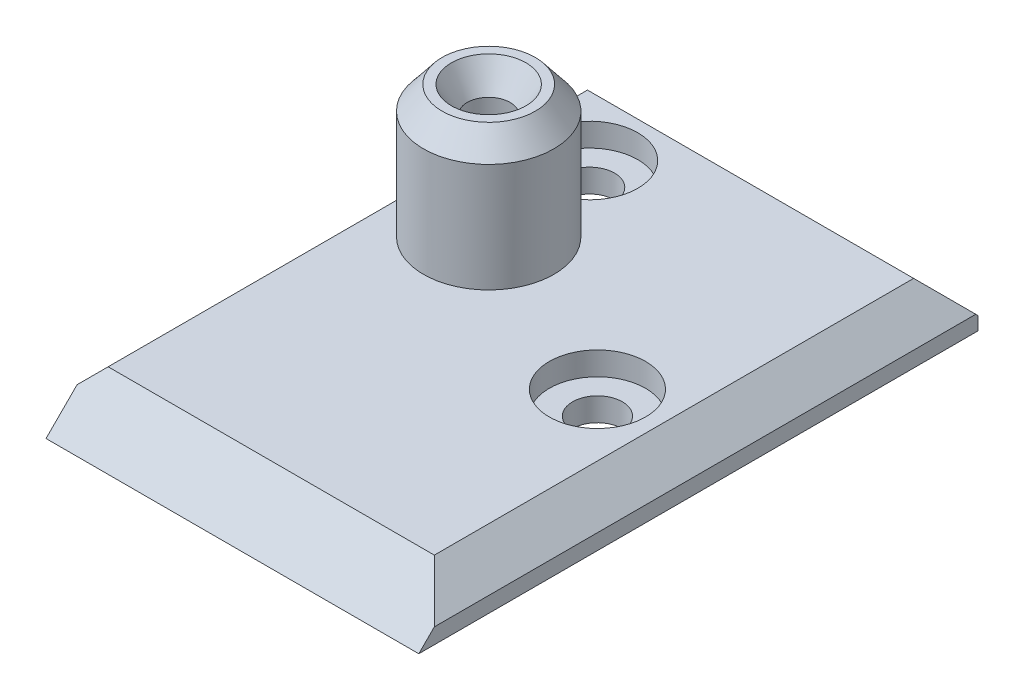
ISO-10303-21;
HEADER;
FILE_DESCRIPTION(('STEP AP214'),'2;1');
FILE_NAME('part.step','',(''),(''),'','','');
FILE_SCHEMA(('AUTOMOTIVE_DESIGN { 1 0 10303 214 1 1 1 1 }'));
ENDSEC;
DATA;
#1=APPLICATION_CONTEXT('core data for automotive mechanical design processes');
#2=APPLICATION_PROTOCOL_DEFINITION('international standard','automotive_design',2000,#1);
#3=PRODUCT_CONTEXT('',#1,'mechanical');
#4=PRODUCT('Part','Part','',(#3));
#5=PRODUCT_RELATED_PRODUCT_CATEGORY('part','',(#4));
#6=PRODUCT_DEFINITION_FORMATION('','',#4);
#7=PRODUCT_DEFINITION_CONTEXT('part definition',#1,'design');
#8=PRODUCT_DEFINITION('design','',#6,#7);
#9=PRODUCT_DEFINITION_SHAPE('','',#8);
#10=(LENGTH_UNIT() NAMED_UNIT(*) SI_UNIT(.MILLI.,.METRE.));
#11=(NAMED_UNIT(*) PLANE_ANGLE_UNIT() SI_UNIT($,.RADIAN.));
#12=(NAMED_UNIT(*) SI_UNIT($,.STERADIAN.) SOLID_ANGLE_UNIT());
#13=UNCERTAINTY_MEASURE_WITH_UNIT(LENGTH_MEASURE(1.E-05),#10,'distance_accuracy_value','');
#14=(GEOMETRIC_REPRESENTATION_CONTEXT(3) GLOBAL_UNCERTAINTY_ASSIGNED_CONTEXT((#13)) GLOBAL_UNIT_ASSIGNED_CONTEXT((#10,
#11,#12)) REPRESENTATION_CONTEXT('',''));
#15=CARTESIAN_POINT('',(0.,0.,0.));
#16=DIRECTION('',(0.,0.,1.));
#17=DIRECTION('',(1.,0.,0.));
#18=AXIS2_PLACEMENT_3D('',#15,#16,#17);
#19=CARTESIAN_POINT('',(0.,61.5,-17.));
#20=DIRECTION('',(0.,-1.,0.));
#21=DIRECTION('',(0.,0.,-1.));
#22=AXIS2_PLACEMENT_3D('',#19,#20,#21);
#23=PLANE('',#22);
#24=CARTESIAN_POINT('',(0.,61.5000000000237,-17.));
#25=DIRECTION('',(0.,1.,0.));
#26=DIRECTION('',(-1.,0.,0.));
#27=AXIS2_PLACEMENT_3D('',#24,#25,#26);
#28=CIRCLE('',#27,2.40000000004557);
#29=CARTESIAN_POINT('',(-2.40000000004557,61.5000000000237,-17.));
#30=VERTEX_POINT('',#29);
#31=EDGE_CURVE('E18',#30,#30,#28,.F.);
#32=ORIENTED_EDGE('',*,*,#31,.T.);
#33=EDGE_LOOP('',(#32));
#34=FACE_BOUND('',#33,.T.);
#35=CARTESIAN_POINT('',(0.,61.4999999999668,-17.));
#36=DIRECTION('',(0.,-1.,0.));
#37=DIRECTION('',(1.,0.,0.));
#38=AXIS2_PLACEMENT_3D('',#35,#36,#37);
#39=CIRCLE('',#38,3.00000000007685);
#40=CARTESIAN_POINT('',(3.00000000007685,61.4999999999668,-17.));
#41=VERTEX_POINT('',#40);
#42=EDGE_CURVE('E145',#41,#41,#39,.T.);
#43=ORIENTED_EDGE('',*,*,#42,.F.);
#44=EDGE_LOOP('',(#43));
#45=FACE_BOUND('',#44,.T.);
#46=ADVANCED_FACE('F15',(#34,#45),#23,.F.);
#47=CARTESIAN_POINT('',(0.,61.4999999997963,-17.));
#48=DIRECTION('',(0.,1.,0.));
#49=DIRECTION('',(-1.,0.,0.));
#50=AXIS2_PLACEMENT_3D('',#47,#48,#49);
#51=CONICAL_SURFACE('',#50,2.39999999990914,0.540419500280418);
#52=CARTESIAN_POINT('',(0.,59.7999999999956,-17.));
#53=DIRECTION('',(0.,1.,0.));
#54=DIRECTION('',(-1.,0.,0.));
#55=AXIS2_PLACEMENT_3D('',#52,#53,#54);
#56=CIRCLE('',#55,1.38000000000602);
#57=CARTESIAN_POINT('',(-1.38000000000603,59.7999999999956,-17.));
#58=VERTEX_POINT('',#57);
#59=EDGE_CURVE('E115',#58,#58,#56,.T.);
#60=ORIENTED_EDGE('',*,*,#59,.F.);
#61=EDGE_LOOP('',(#60));
#62=FACE_BOUND('',#61,.T.);
#63=ORIENTED_EDGE('',*,*,#31,.F.);
#64=EDGE_LOOP('',(#63));
#65=FACE_BOUND('',#64,.T.);
#66=ADVANCED_FACE('F154',(#62,#65),#51,.F.);
#67=CARTESIAN_POINT('',(0.,60.0000000001728,-17.));
#68=DIRECTION('',(0.,-1.,0.));
#69=DIRECTION('',(1.,0.,0.));
#70=AXIS2_PLACEMENT_3D('',#67,#68,#69);
#71=CONICAL_SURFACE('',#70,4.19999999991205,0.674740942223552);
#72=CARTESIAN_POINT('',(0.,60.,-17.));
#73=DIRECTION('',(0.,-1.,0.));
#74=DIRECTION('',(0.,0.,-1.));
#75=AXIS2_PLACEMENT_3D('',#72,#73,#74);
#76=CIRCLE('',#75,4.2);
#77=CARTESIAN_POINT('',(0.,60.,-21.2));
#78=VERTEX_POINT('',#77);
#79=EDGE_CURVE('E113',#78,#78,#76,.T.);
#80=ORIENTED_EDGE('',*,*,#79,.F.);
#81=EDGE_LOOP('',(#80));
#82=FACE_BOUND('',#81,.T.);
#83=ORIENTED_EDGE('',*,*,#42,.T.);
#84=EDGE_LOOP('',(#83));
#85=FACE_BOUND('',#84,.T.);
#86=ADVANCED_FACE('F156',(#82,#85),#71,.T.);
#87=CARTESIAN_POINT('',(0.,59.8,-17.));
#88=DIRECTION('',(0.,-1.,0.));
#89=DIRECTION('',(0.,0.,-1.));
#90=AXIS2_PLACEMENT_3D('',#87,#88,#89);
#91=PLANE('',#90);
#92=ORIENTED_EDGE('',*,*,#59,.T.);
#93=EDGE_LOOP('',(#92));
#94=FACE_BOUND('',#93,.T.);
#95=CARTESIAN_POINT('',(0.,59.8,-17.));
#96=DIRECTION('',(0.,-1.,0.));
#97=DIRECTION('',(0.,0.,-1.));
#98=AXIS2_PLACEMENT_3D('',#95,#96,#97);
#99=CIRCLE('',#98,2.2);
#100=CARTESIAN_POINT('',(0.,59.8,-19.2));
#101=VERTEX_POINT('',#100);
#102=EDGE_CURVE('E107',#101,#101,#99,.T.);
#103=ORIENTED_EDGE('',*,*,#102,.T.);
#104=EDGE_LOOP('',(#103));
#105=FACE_BOUND('',#104,.T.);
#106=ADVANCED_FACE('F163',(#94,#105),#91,.T.);
#107=CARTESIAN_POINT('',(0.,60.,-17.));
#108=DIRECTION('',(0.,-1.,0.));
#109=DIRECTION('',(0.,0.,-1.));
#110=AXIS2_PLACEMENT_3D('',#107,#108,#109);
#111=CYLINDRICAL_SURFACE('',#110,4.2);
#112=CARTESIAN_POINT('',(0.,53.,-17.));
#113=DIRECTION('',(0.,-1.,0.));
#114=DIRECTION('',(0.,0.,-1.));
#115=AXIS2_PLACEMENT_3D('',#112,#113,#114);
#116=CIRCLE('',#115,4.2);
#117=CARTESIAN_POINT('',(0.,53.,-21.2));
#118=VERTEX_POINT('',#117);
#119=EDGE_CURVE('E99',#118,#118,#116,.T.);
#120=ORIENTED_EDGE('',*,*,#119,.F.);
#121=EDGE_LOOP('',(#120));
#122=FACE_BOUND('',#121,.T.);
#123=ORIENTED_EDGE('',*,*,#79,.T.);
#124=EDGE_LOOP('',(#123));
#125=FACE_BOUND('',#124,.T.);
#126=ADVANCED_FACE('F233',(#122,#125),#111,.T.);
#127=CARTESIAN_POINT('',(-1.,54.5,-24.5));
#128=DIRECTION('',(0.,-1.,0.));
#129=DIRECTION('',(0.,0.,-1.));
#130=AXIS2_PLACEMENT_3D('',#127,#128,#129);
#131=CYLINDRICAL_SURFACE('',#130,3.1);
#132=CARTESIAN_POINT('',(-1.,51.5,-24.5));
#133=DIRECTION('',(0.,-1.,0.));
#134=DIRECTION('',(0.,0.,-1.));
#135=AXIS2_PLACEMENT_3D('',#132,#133,#134);
#136=CIRCLE('',#135,3.1);
#137=CARTESIAN_POINT('',(-1.,51.5,-27.6));
#138=VERTEX_POINT('',#137);
#139=EDGE_CURVE('E112',#138,#138,#136,.T.);
#140=ORIENTED_EDGE('',*,*,#139,.T.);
#141=EDGE_LOOP('',(#140));
#142=FACE_BOUND('',#141,.T.);
#143=CARTESIAN_POINT('',(-1.,53.,-24.5));
#144=DIRECTION('',(0.,-1.,0.));
#145=DIRECTION('',(0.,0.,-1.));
#146=AXIS2_PLACEMENT_3D('',#143,#144,#145);
#147=CIRCLE('',#146,3.1);
#148=CARTESIAN_POINT('',(-1.,53.,-27.6));
#149=VERTEX_POINT('',#148);
#150=EDGE_CURVE('E96',#149,#149,#147,.T.);
#151=ORIENTED_EDGE('',*,*,#150,.F.);
#152=EDGE_LOOP('',(#151));
#153=FACE_BOUND('',#152,.T.);
#154=ADVANCED_FACE('F229',(#142,#153),#131,.F.);
#155=CARTESIAN_POINT('',(0.,59.8,-17.));
#156=DIRECTION('',(0.,-1.,0.));
#157=DIRECTION('',(0.,0.,-1.));
#158=AXIS2_PLACEMENT_3D('',#155,#156,#157);
#159=CYLINDRICAL_SURFACE('',#158,2.2);
#160=CARTESIAN_POINT('',(0.,53.8999999999987,-17.));
#161=DIRECTION('',(0.,-1.,0.));
#162=DIRECTION('',(1.,0.,0.));
#163=AXIS2_PLACEMENT_3D('',#160,#161,#162);
#164=CIRCLE('',#163,2.20000000000198);
#165=CARTESIAN_POINT('',(2.20000000000198,53.8999999999987,-17.));
#166=VERTEX_POINT('',#165);
#167=EDGE_CURVE('E108',#166,#166,#164,.T.);
#168=ORIENTED_EDGE('',*,*,#167,.T.);
#169=EDGE_LOOP('',(#168));
#170=FACE_BOUND('',#169,.T.);
#171=ORIENTED_EDGE('',*,*,#102,.F.);
#172=EDGE_LOOP('',(#171));
#173=FACE_BOUND('',#172,.T.);
#174=ADVANCED_FACE('F225',(#170,#173),#159,.F.);
#175=CARTESIAN_POINT('',(12.,54.5,-12.));
#176=DIRECTION('',(0.,-1.,0.));
#177=DIRECTION('',(0.,0.,-1.));
#178=AXIS2_PLACEMENT_3D('',#175,#176,#177);
#179=CYLINDRICAL_SURFACE('',#178,3.1);
#180=CARTESIAN_POINT('',(12.,51.5,-12.));
#181=DIRECTION('',(0.,-1.,0.));
#182=DIRECTION('',(0.,0.,-1.));
#183=AXIS2_PLACEMENT_3D('',#180,#181,#182);
#184=CIRCLE('',#183,3.1);
#185=CARTESIAN_POINT('',(12.,51.5,-15.1));
#186=VERTEX_POINT('',#185);
#187=EDGE_CURVE('E111',#186,#186,#184,.T.);
#188=ORIENTED_EDGE('',*,*,#187,.T.);
#189=EDGE_LOOP('',(#188));
#190=FACE_BOUND('',#189,.T.);
#191=CARTESIAN_POINT('',(12.,53.,-12.));
#192=DIRECTION('',(0.,-1.,0.));
#193=DIRECTION('',(0.,0.,-1.));
#194=AXIS2_PLACEMENT_3D('',#191,#192,#193);
#195=CIRCLE('',#194,3.1);
#196=CARTESIAN_POINT('',(12.,53.,-15.1));
#197=VERTEX_POINT('',#196);
#198=EDGE_CURVE('E137',#197,#197,#195,.T.);
#199=ORIENTED_EDGE('',*,*,#198,.F.);
#200=EDGE_LOOP('',(#199));
#201=FACE_BOUND('',#200,.T.);
#202=ADVANCED_FACE('F222',(#190,#201),#179,.F.);
#203=CARTESIAN_POINT('',(-8.,49.428932188135,-31.92893218813));
#204=DIRECTION('',(0.,-0.707106781186548,0.707106781186548));
#205=DIRECTION('',(0.,-0.707106781186548,-0.707106781186548));
#206=AXIS2_PLACEMENT_3D('',#203,#204,#205);
#207=PLANE('',#206);
#208=DIRECTION('',(0.,-0.707106781186548,-0.707106781186548));
#209=VECTOR('',#208,1.);
#210=CARTESIAN_POINT('',(18.,49.428932188135,-31.92893218813));
#211=LINE('',#210,#209);
#212=CARTESIAN_POINT('',(18.,50.857864376268,-30.499999999999));
#213=VERTEX_POINT('',#212);
#214=CARTESIAN_POINT('',(18.,51.0000000000013,-30.3578643762613));
#215=VERTEX_POINT('',#214);
#216=EDGE_CURVE('E93',#213,#215,#211,.F.);
#217=ORIENTED_EDGE('',*,*,#216,.F.);
#218=DIRECTION('',(1.,0.,0.));
#219=VECTOR('',#218,1.);
#220=CARTESIAN_POINT('',(-6.,50.857864376269,-30.5));
#221=LINE('',#220,#219);
#222=CARTESIAN_POINT('',(-6.,50.857864376268,-30.499999999999));
#223=VERTEX_POINT('',#222);
#224=EDGE_CURVE('E133',#213,#223,#221,.F.);
#225=ORIENTED_EDGE('',*,*,#224,.T.);
#226=DIRECTION('',(0.,-0.707106781186548,-0.707106781186548));
#227=VECTOR('',#226,1.);
#228=CARTESIAN_POINT('',(-6.,49.428932188135,-31.92893218813));
#229=LINE('',#228,#227);
#230=CARTESIAN_POINT('',(-6.,52.0000000000013,-29.3578643762612));
#231=VERTEX_POINT('',#230);
#232=EDGE_CURVE('E89',#231,#223,#229,.T.);
#233=ORIENTED_EDGE('',*,*,#232,.F.);
#234=DIRECTION('',(-0.577350269189626,-0.577350269189625,-0.577350269189627));
#235=VECTOR('',#234,1.);
#236=CARTESIAN_POINT('',(-5.,53.,-28.35786437626));
#237=LINE('',#236,#235);
#238=CARTESIAN_POINT('',(-5.,53.0000000000013,-28.3578643762612));
#239=VERTEX_POINT('',#238);
#240=EDGE_CURVE('E86',#239,#231,#237,.T.);
#241=ORIENTED_EDGE('',*,*,#240,.F.);
#242=DIRECTION('',(1.,0.,0.));
#243=VECTOR('',#242,1.);
#244=CARTESIAN_POINT('',(-6.,53.,-28.35786437626));
#245=LINE('',#244,#243);
#246=CARTESIAN_POINT('',(16.,53.0000000000006,-28.3578643762606));
#247=VERTEX_POINT('',#246);
#248=EDGE_CURVE('E72',#247,#239,#245,.F.);
#249=ORIENTED_EDGE('',*,*,#248,.F.);
#250=DIRECTION('',(-0.577350269189626,0.577350269189625,0.577350269189626));
#251=VECTOR('',#250,1.);
#252=CARTESIAN_POINT('',(18.,51.,-30.35786437626));
#253=LINE('',#252,#251);
#254=EDGE_CURVE('E136',#215,#247,#253,.T.);
#255=ORIENTED_EDGE('',*,*,#254,.F.);
#256=EDGE_LOOP('',(#217,#225,#233,#241,#249,#255));
#257=FACE_BOUND('',#256,.T.);
#258=ADVANCED_FACE('F87',(#257),#207,.F.);
#259=CARTESIAN_POINT('',(-9.,49.,-38.));
#260=DIRECTION('',(-0.707106781186548,0.707106781186548,0.));
#261=DIRECTION('',(-0.707106781186548,-0.707106781186548,0.));
#262=AXIS2_PLACEMENT_3D('',#259,#260,#261);
#263=PLANE('',#262);
#264=DIRECTION('',(0.,0.,-1.));
#265=VECTOR('',#264,1.);
#266=CARTESIAN_POINT('',(-6.,52.,-30.5));
#267=LINE('',#266,#265);
#268=CARTESIAN_POINT('',(-6.,52.,3.5));
#269=VERTEX_POINT('',#268);
#270=EDGE_CURVE('E412',#231,#269,#267,.F.);
#271=ORIENTED_EDGE('',*,*,#270,.T.);
#272=DIRECTION('',(0.577350269189625,0.577350269189624,-0.577350269189628));
#273=VECTOR('',#272,1.);
#274=CARTESIAN_POINT('',(-6.,52.,3.50000000000002));
#275=LINE('',#274,#273);
#276=CARTESIAN_POINT('',(-5.,53.,2.5));
#277=VERTEX_POINT('',#276);
#278=EDGE_CURVE('E83',#269,#277,#275,.T.);
#279=ORIENTED_EDGE('',*,*,#278,.T.);
#280=DIRECTION('',(0.,0.,1.));
#281=VECTOR('',#280,1.);
#282=CARTESIAN_POINT('',(-5.,53.,-30.5));
#283=LINE('',#282,#281);
#284=EDGE_CURVE('E80',#239,#277,#283,.T.);
#285=ORIENTED_EDGE('',*,*,#284,.F.);
#286=ORIENTED_EDGE('',*,*,#240,.T.);
#287=EDGE_LOOP('',(#271,#279,#285,#286));
#288=FACE_BOUND('',#287,.T.);
#289=ADVANCED_FACE('F95',(#288),#263,.T.);
#290=CARTESIAN_POINT('',(-6.,53.,-30.5));
#291=DIRECTION('',(0.,1.,0.));
#292=DIRECTION('',(0.,0.,1.));
#293=AXIS2_PLACEMENT_3D('',#290,#291,#292);
#294=PLANE('',#293);
#295=ORIENTED_EDGE('',*,*,#198,.T.);
#296=EDGE_LOOP('',(#295));
#297=FACE_BOUND('',#296,.T.);
#298=ORIENTED_EDGE('',*,*,#119,.T.);
#299=EDGE_LOOP('',(#298));
#300=FACE_BOUND('',#299,.T.);
#301=ORIENTED_EDGE('',*,*,#150,.T.);
#302=EDGE_LOOP('',(#301));
#303=FACE_BOUND('',#302,.T.);
#304=DIRECTION('',(1.,0.,0.));
#305=VECTOR('',#304,1.);
#306=CARTESIAN_POINT('',(-8.,53.,2.5));
#307=LINE('',#306,#305);
#308=CARTESIAN_POINT('',(16.,53.,2.50000000000001));
#309=VERTEX_POINT('',#308);
#310=EDGE_CURVE('E403',#309,#277,#307,.F.);
#311=ORIENTED_EDGE('',*,*,#310,.F.);
#312=DIRECTION('',(0.,0.,1.));
#313=VECTOR('',#312,1.);
#314=CARTESIAN_POINT('',(16.,53.,-40.));
#315=LINE('',#314,#313);
#316=EDGE_CURVE('E82',#247,#309,#315,.T.);
#317=ORIENTED_EDGE('',*,*,#316,.F.);
#318=ORIENTED_EDGE('',*,*,#248,.T.);
#319=ORIENTED_EDGE('',*,*,#284,.T.);
#320=EDGE_LOOP('',(#311,#317,#318,#319));
#321=FACE_BOUND('',#320,.T.);
#322=ADVANCED_FACE('F78',(#297,#300,#303,#321),#294,.T.);
#323=CARTESIAN_POINT('',(19.,50.,-40.));
#324=DIRECTION('',(0.707106781186548,0.707106781186548,0.));
#325=DIRECTION('',(-0.707106781186548,0.707106781186548,0.));
#326=AXIS2_PLACEMENT_3D('',#323,#324,#325);
#327=PLANE('',#326);
#328=DIRECTION('',(0.,0.,-1.));
#329=VECTOR('',#328,1.);
#330=CARTESIAN_POINT('',(18.,51.,-30.5));
#331=LINE('',#330,#329);
#332=CARTESIAN_POINT('',(18.,51.,4.50000000000001));
#333=VERTEX_POINT('',#332);
#334=EDGE_CURVE('E397',#215,#333,#331,.F.);
#335=ORIENTED_EDGE('',*,*,#334,.F.);
#336=ORIENTED_EDGE('',*,*,#254,.T.);
#337=ORIENTED_EDGE('',*,*,#316,.T.);
#338=DIRECTION('',(-0.577350269189627,0.577350269189625,-0.577350269189625));
#339=VECTOR('',#338,1.);
#340=CARTESIAN_POINT('',(18.,51.,4.5));
#341=LINE('',#340,#339);
#342=EDGE_CURVE('E399',#333,#309,#341,.T.);
#343=ORIENTED_EDGE('',*,*,#342,.F.);
#344=EDGE_LOOP('',(#335,#336,#337,#343));
#345=FACE_BOUND('',#344,.T.);
#346=ADVANCED_FACE('F210',(#345),#327,.T.);
#347=CARTESIAN_POINT('',(-1.,51.5,-24.5));
#348=DIRECTION('',(0.,-1.,0.));
#349=DIRECTION('',(0.,0.,-1.));
#350=AXIS2_PLACEMENT_3D('',#347,#348,#349);
#351=PLANE('',#350);
#352=CARTESIAN_POINT('',(-1.,51.5,-24.5));
#353=DIRECTION('',(0.,-1.,0.));
#354=DIRECTION('',(0.,0.,-1.));
#355=AXIS2_PLACEMENT_3D('',#352,#353,#354);
#356=CIRCLE('',#355,1.6);
#357=CARTESIAN_POINT('',(-1.,51.5,-26.1));
#358=VERTEX_POINT('',#357);
#359=EDGE_CURVE('E127',#358,#358,#356,.T.);
#360=ORIENTED_EDGE('',*,*,#359,.T.);
#361=EDGE_LOOP('',(#360));
#362=FACE_BOUND('',#361,.T.);
#363=ORIENTED_EDGE('',*,*,#139,.F.);
#364=EDGE_LOOP('',(#363));
#365=FACE_BOUND('',#364,.T.);
#366=ADVANCED_FACE('F206',(#362,#365),#351,.F.);
#367=CARTESIAN_POINT('',(0.,50.0000000001819,-17.));
#368=DIRECTION('',(0.,-1.,0.));
#369=DIRECTION('',(1.,0.,0.));
#370=AXIS2_PLACEMENT_3D('',#367,#368,#369);
#371=CONICAL_SURFACE('',#370,2.97999999996534,0.197395559847076);
#372=ORIENTED_EDGE('',*,*,#167,.F.);
#373=EDGE_LOOP('',(#372));
#374=FACE_BOUND('',#373,.T.);
#375=CARTESIAN_POINT('',(0.,50.0000000000682,-17.));
#376=DIRECTION('',(0.,-1.,0.));
#377=DIRECTION('',(1.,0.,0.));
#378=AXIS2_PLACEMENT_3D('',#375,#376,#377);
#379=CIRCLE('',#378,2.97999999998808);
#380=CARTESIAN_POINT('',(2.97999999998808,50.0000000000682,-17.));
#381=VERTEX_POINT('',#380);
#382=EDGE_CURVE('E124',#381,#381,#379,.F.);
#383=ORIENTED_EDGE('',*,*,#382,.F.);
#384=EDGE_LOOP('',(#383));
#385=FACE_BOUND('',#384,.T.);
#386=ADVANCED_FACE('F202',(#374,#385),#371,.F.);
#387=CARTESIAN_POINT('',(12.,51.5,-12.));
#388=DIRECTION('',(0.,-1.,0.));
#389=DIRECTION('',(0.,0.,-1.));
#390=AXIS2_PLACEMENT_3D('',#387,#388,#389);
#391=PLANE('',#390);
#392=CARTESIAN_POINT('',(12.,51.5,-12.));
#393=DIRECTION('',(0.,-1.,0.));
#394=DIRECTION('',(0.,0.,-1.));
#395=AXIS2_PLACEMENT_3D('',#392,#393,#394);
#396=CIRCLE('',#395,1.6);
#397=CARTESIAN_POINT('',(12.,51.5,-13.6));
#398=VERTEX_POINT('',#397);
#399=EDGE_CURVE('E120',#398,#398,#396,.T.);
#400=ORIENTED_EDGE('',*,*,#399,.T.);
#401=EDGE_LOOP('',(#400));
#402=FACE_BOUND('',#401,.T.);
#403=ORIENTED_EDGE('',*,*,#187,.F.);
#404=EDGE_LOOP('',(#403));
#405=FACE_BOUND('',#404,.T.);
#406=ADVANCED_FACE('F198',(#402,#405),#391,.F.);
#407=CARTESIAN_POINT('',(-6.,50.,-30.5));
#408=DIRECTION('',(0.,0.,1.));
#409=DIRECTION('',(1.,0.,0.));
#410=AXIS2_PLACEMENT_3D('',#407,#408,#409);
#411=PLANE('',#410);
#412=DIRECTION('',(1.,0.,0.));
#413=VECTOR('',#412,1.);
#414=CARTESIAN_POINT('',(-6.,50.,-30.5));
#415=LINE('',#414,#413);
#416=CARTESIAN_POINT('',(18.,50.,-30.5));
#417=VERTEX_POINT('',#416);
#418=CARTESIAN_POINT('',(-6.,50.,-30.5));
#419=VERTEX_POINT('',#418);
#420=EDGE_CURVE('E123',#417,#419,#415,.F.);
#421=ORIENTED_EDGE('',*,*,#420,.T.);
#422=DIRECTION('',(0.,1.,0.));
#423=VECTOR('',#422,1.);
#424=CARTESIAN_POINT('',(-6.,50.,-30.5));
#425=LINE('',#424,#423);
#426=EDGE_CURVE('E409',#419,#223,#425,.T.);
#427=ORIENTED_EDGE('',*,*,#426,.T.);
#428=ORIENTED_EDGE('',*,*,#224,.F.);
#429=DIRECTION('',(0.,1.,0.));
#430=VECTOR('',#429,1.);
#431=CARTESIAN_POINT('',(18.,50.,-30.5));
#432=LINE('',#431,#430);
#433=EDGE_CURVE('E130',#417,#213,#432,.T.);
#434=ORIENTED_EDGE('',*,*,#433,.F.);
#435=EDGE_LOOP('',(#421,#427,#428,#434));
#436=FACE_BOUND('',#435,.T.);
#437=ADVANCED_FACE('F194',(#436),#411,.F.);
#438=CARTESIAN_POINT('',(-6.,50.,-30.5));
#439=DIRECTION('',(1.,0.,0.));
#440=DIRECTION('',(0.,0.,-1.));
#441=AXIS2_PLACEMENT_3D('',#438,#439,#440);
#442=PLANE('',#441);
#443=DIRECTION('',(0.,0.,1.));
#444=VECTOR('',#443,1.);
#445=CARTESIAN_POINT('',(-6.,50.,-30.5));
#446=LINE('',#445,#444);
#447=CARTESIAN_POINT('',(-6.,50.,5.5));
#448=VERTEX_POINT('',#447);
#449=EDGE_CURVE('E421',#419,#448,#446,.T.);
#450=ORIENTED_EDGE('',*,*,#449,.T.);
#451=DIRECTION('',(0.,-0.707106781186548,0.707106781186548));
#452=VECTOR('',#451,1.);
#453=CARTESIAN_POINT('',(-6.,56.5,-1.));
#454=LINE('',#453,#452);
#455=EDGE_CURVE('E400',#269,#448,#454,.T.);
#456=ORIENTED_EDGE('',*,*,#455,.F.);
#457=ORIENTED_EDGE('',*,*,#270,.F.);
#458=ORIENTED_EDGE('',*,*,#232,.T.);
#459=ORIENTED_EDGE('',*,*,#426,.F.);
#460=EDGE_LOOP('',(#450,#456,#457,#458,#459));
#461=FACE_BOUND('',#460,.T.);
#462=ADVANCED_FACE('F190',(#461),#442,.F.);
#463=CARTESIAN_POINT('',(-8.,56.5,-1.));
#464=DIRECTION('',(0.,0.707106781186548,0.707106781186548));
#465=DIRECTION('',(0.,-0.707106781186548,0.707106781186548));
#466=AXIS2_PLACEMENT_3D('',#463,#464,#465);
#467=PLANE('',#466);
#468=ORIENTED_EDGE('',*,*,#278,.F.);
#469=ORIENTED_EDGE('',*,*,#455,.T.);
#470=DIRECTION('',(1.,0.,0.));
#471=VECTOR('',#470,1.);
#472=CARTESIAN_POINT('',(-6.,50.,5.5));
#473=LINE('',#472,#471);
#474=CARTESIAN_POINT('',(18.,50.,5.5));
#475=VERTEX_POINT('',#474);
#476=EDGE_CURVE('E416',#448,#475,#473,.T.);
#477=ORIENTED_EDGE('',*,*,#476,.T.);
#478=DIRECTION('',(0.,-0.70710678118655,0.707106781186545));
#479=VECTOR('',#478,1.);
#480=CARTESIAN_POINT('',(18.,51.,4.5));
#481=LINE('',#480,#479);
#482=EDGE_CURVE('E33',#333,#475,#481,.T.);
#483=ORIENTED_EDGE('',*,*,#482,.F.);
#484=ORIENTED_EDGE('',*,*,#342,.T.);
#485=ORIENTED_EDGE('',*,*,#310,.T.);
#486=EDGE_LOOP('',(#468,#469,#477,#483,#484,#485));
#487=FACE_BOUND('',#486,.T.);
#488=ADVANCED_FACE('F187',(#487),#467,.T.);
#489=CARTESIAN_POINT('',(18.,50.,-30.5));
#490=DIRECTION('',(1.,0.,0.));
#491=DIRECTION('',(0.,0.,-1.));
#492=AXIS2_PLACEMENT_3D('',#489,#490,#491);
#493=PLANE('',#492);
#494=ORIENTED_EDGE('',*,*,#433,.T.);
#495=ORIENTED_EDGE('',*,*,#216,.T.);
#496=ORIENTED_EDGE('',*,*,#334,.T.);
#497=ORIENTED_EDGE('',*,*,#482,.T.);
#498=DIRECTION('',(0.,0.,1.));
#499=VECTOR('',#498,1.);
#500=CARTESIAN_POINT('',(18.,50.,-30.5));
#501=LINE('',#500,#499);
#502=EDGE_CURVE('E119',#475,#417,#501,.F.);
#503=ORIENTED_EDGE('',*,*,#502,.T.);
#504=EDGE_LOOP('',(#494,#495,#496,#497,#503));
#505=FACE_BOUND('',#504,.T.);
#506=ADVANCED_FACE('F183',(#505),#493,.T.);
#507=CARTESIAN_POINT('',(-1.,60.,-24.5));
#508=DIRECTION('',(0.,-1.,0.));
#509=DIRECTION('',(0.,0.,-1.));
#510=AXIS2_PLACEMENT_3D('',#507,#508,#509);
#511=CYLINDRICAL_SURFACE('',#510,1.6);
#512=ORIENTED_EDGE('',*,*,#359,.F.);
#513=EDGE_LOOP('',(#512));
#514=FACE_BOUND('',#513,.T.);
#515=CARTESIAN_POINT('',(-1.,50.,-24.5));
#516=DIRECTION('',(0.,-1.,0.));
#517=DIRECTION('',(0.,0.,-1.));
#518=AXIS2_PLACEMENT_3D('',#515,#516,#517);
#519=CIRCLE('',#518,1.6);
#520=CARTESIAN_POINT('',(-1.,50.,-26.1));
#521=VERTEX_POINT('',#520);
#522=EDGE_CURVE('E24',#521,#521,#519,.T.);
#523=ORIENTED_EDGE('',*,*,#522,.T.);
#524=EDGE_LOOP('',(#523));
#525=FACE_BOUND('',#524,.T.);
#526=ADVANCED_FACE('F175',(#514,#525),#511,.F.);
#527=CARTESIAN_POINT('',(12.,60.,-12.));
#528=DIRECTION('',(0.,-1.,0.));
#529=DIRECTION('',(0.,0.,-1.));
#530=AXIS2_PLACEMENT_3D('',#527,#528,#529);
#531=CYLINDRICAL_SURFACE('',#530,1.6);
#532=ORIENTED_EDGE('',*,*,#399,.F.);
#533=EDGE_LOOP('',(#532));
#534=FACE_BOUND('',#533,.T.);
#535=CARTESIAN_POINT('',(12.,50.,-12.));
#536=DIRECTION('',(0.,-1.,0.));
#537=DIRECTION('',(0.,0.,-1.));
#538=AXIS2_PLACEMENT_3D('',#535,#536,#537);
#539=CIRCLE('',#538,1.6);
#540=CARTESIAN_POINT('',(12.,50.,-13.6));
#541=VERTEX_POINT('',#540);
#542=EDGE_CURVE('E10',#541,#541,#539,.T.);
#543=ORIENTED_EDGE('',*,*,#542,.T.);
#544=EDGE_LOOP('',(#543));
#545=FACE_BOUND('',#544,.T.);
#546=ADVANCED_FACE('F169',(#534,#545),#531,.F.);
#547=CARTESIAN_POINT('',(-6.,50.,-30.5));
#548=DIRECTION('',(0.,1.,0.));
#549=DIRECTION('',(0.,0.,1.));
#550=AXIS2_PLACEMENT_3D('',#547,#548,#549);
#551=PLANE('',#550);
#552=ORIENTED_EDGE('',*,*,#542,.F.);
#553=EDGE_LOOP('',(#552));
#554=FACE_BOUND('',#553,.T.);
#555=ORIENTED_EDGE('',*,*,#522,.F.);
#556=EDGE_LOOP('',(#555));
#557=FACE_BOUND('',#556,.T.);
#558=ORIENTED_EDGE('',*,*,#476,.F.);
#559=ORIENTED_EDGE('',*,*,#449,.F.);
#560=ORIENTED_EDGE('',*,*,#420,.F.);
#561=ORIENTED_EDGE('',*,*,#502,.F.);
#562=EDGE_LOOP('',(#558,#559,#560,#561));
#563=FACE_BOUND('',#562,.T.);
#564=ORIENTED_EDGE('',*,*,#382,.T.);
#565=EDGE_LOOP('',(#564));
#566=FACE_BOUND('',#565,.T.);
#567=ADVANCED_FACE('F167',(#554,#557,#563,#566),#551,.F.);
#568=CLOSED_SHELL('',(#46,#66,#86,#106,#126,#154,#174,#202,#258,#289,#322,#346,#366,#386,#406,
#437,#462,#488,#506,#526,#546,#567));
#569=MANIFOLD_SOLID_BREP('B1',#568);
#570=ADVANCED_BREP_SHAPE_REPRESENTATION('',(#18,#569),#14);
#571=SHAPE_DEFINITION_REPRESENTATION(#9,#570);
ENDSEC;
END-ISO-10303-21;
